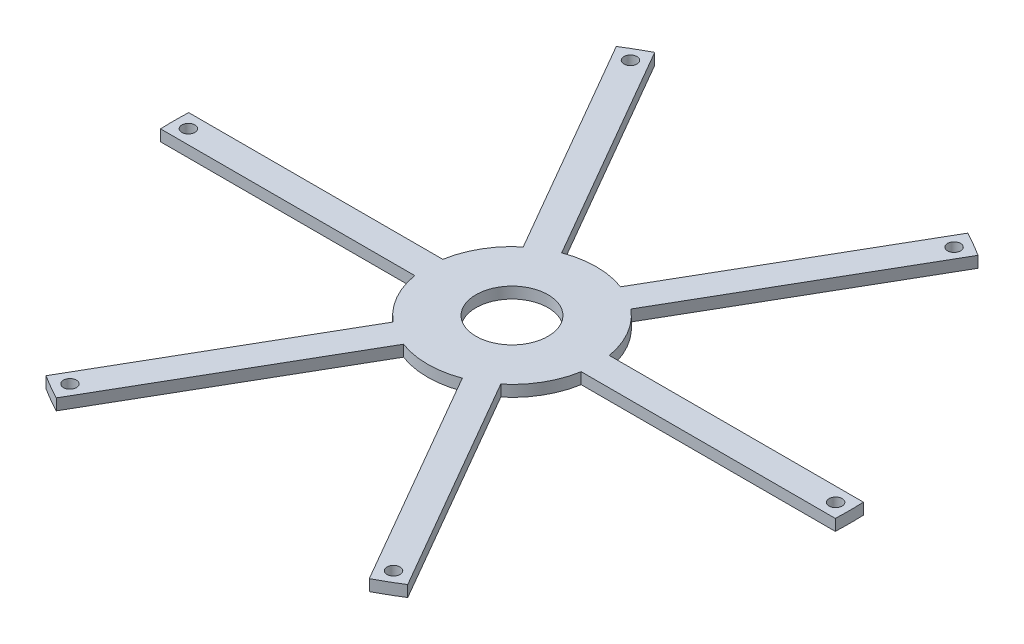
ISO-10303-21;
HEADER;
FILE_DESCRIPTION(('STEP AP214'),'2;1');
FILE_NAME('part.step','',(''),(''),'','','');
FILE_SCHEMA(('AUTOMOTIVE_DESIGN { 1 0 10303 214 1 1 1 1 }'));
ENDSEC;
DATA;
#1=APPLICATION_CONTEXT('core data for automotive mechanical design processes');
#2=APPLICATION_PROTOCOL_DEFINITION('international standard','automotive_design',2000,#1);
#3=PRODUCT_CONTEXT('',#1,'mechanical');
#4=PRODUCT('Part','Part','',(#3));
#5=PRODUCT_RELATED_PRODUCT_CATEGORY('part','',(#4));
#6=PRODUCT_DEFINITION_FORMATION('','',#4);
#7=PRODUCT_DEFINITION_CONTEXT('part definition',#1,'design');
#8=PRODUCT_DEFINITION('design','',#6,#7);
#9=PRODUCT_DEFINITION_SHAPE('','',#8);
#10=(LENGTH_UNIT() NAMED_UNIT(*) SI_UNIT(.MILLI.,.METRE.));
#11=(NAMED_UNIT(*) PLANE_ANGLE_UNIT() SI_UNIT($,.RADIAN.));
#12=(NAMED_UNIT(*) SI_UNIT($,.STERADIAN.) SOLID_ANGLE_UNIT());
#13=UNCERTAINTY_MEASURE_WITH_UNIT(LENGTH_MEASURE(1.E-05),#10,'distance_accuracy_value','');
#14=(GEOMETRIC_REPRESENTATION_CONTEXT(3) GLOBAL_UNCERTAINTY_ASSIGNED_CONTEXT((#13)) GLOBAL_UNIT_ASSIGNED_CONTEXT((#10,
#11,#12)) REPRESENTATION_CONTEXT('',''));
#15=CARTESIAN_POINT('',(0.,0.,0.));
#16=DIRECTION('',(0.,0.,1.));
#17=DIRECTION('',(1.,0.,0.));
#18=AXIS2_PLACEMENT_3D('',#15,#16,#17);
#19=CARTESIAN_POINT('',(0.,2.54,0.));
#20=DIRECTION('',(0.,-1.,0.));
#21=DIRECTION('',(0.,0.,-1.));
#22=AXIS2_PLACEMENT_3D('',#19,#20,#21);
#23=CYLINDRICAL_SURFACE('',#22,19.05);
#24=CARTESIAN_POINT('',(0.,0.,0.));
#25=DIRECTION('',(0.,1.,0.));
#26=DIRECTION('',(0.,0.,1.));
#27=AXIS2_PLACEMENT_3D('',#24,#25,#26);
#28=CIRCLE('',#27,19.05);
#29=CARTESIAN_POINT('',(18.7835533113413,0.,-3.175));
#30=VERTEX_POINT('',#29);
#31=CARTESIAN_POINT('',(12.1414073126864,0.,-14.6795343409607));
#32=VERTEX_POINT('',#31);
#33=EDGE_CURVE('E233',#30,#32,#28,.T.);
#34=ORIENTED_EDGE('',*,*,#33,.T.);
#35=DIRECTION('',(0.,-1.,0.));
#36=VECTOR('',#35,1.);
#37=CARTESIAN_POINT('',(12.1414073126864,2.54,-14.6795343409607));
#38=LINE('',#37,#36);
#39=CARTESIAN_POINT('',(12.1414073126864,2.54,-14.6795343409607));
#40=VERTEX_POINT('',#39);
#41=EDGE_CURVE('E11',#40,#32,#38,.T.);
#42=ORIENTED_EDGE('',*,*,#41,.F.);
#43=CARTESIAN_POINT('',(0.,2.54,0.));
#44=DIRECTION('',(0.,1.,0.));
#45=DIRECTION('',(0.,0.,1.));
#46=AXIS2_PLACEMENT_3D('',#43,#44,#45);
#47=CIRCLE('',#46,19.05);
#48=CARTESIAN_POINT('',(18.7835533113413,2.54,-3.175));
#49=VERTEX_POINT('',#48);
#50=EDGE_CURVE('E282',#49,#40,#47,.T.);
#51=ORIENTED_EDGE('',*,*,#50,.F.);
#52=DIRECTION('',(0.,-1.,0.));
#53=VECTOR('',#52,1.);
#54=CARTESIAN_POINT('',(18.7835533113413,2.54,-3.175));
#55=LINE('',#54,#53);
#56=EDGE_CURVE('E229',#49,#30,#55,.T.);
#57=ORIENTED_EDGE('',*,*,#56,.T.);
#58=EDGE_LOOP('',(#34,#42,#51,#57));
#59=FACE_BOUND('',#58,.T.);
#60=ADVANCED_FACE('F37',(#59),#23,.T.);
#61=CARTESIAN_POINT('',(12.1414073126864,2.54,-14.6795343409607));
#62=DIRECTION('',(-0.866025403784433,0.,-0.50000000000001));
#63=DIRECTION('',(-0.50000000000001,0.,0.866025403784433));
#64=AXIS2_PLACEMENT_3D('',#61,#62,#63);
#65=PLANE('',#64);
#66=DIRECTION('',(0.50000000000001,0.,-0.866025403784433));
#67=VECTOR('',#66,1.);
#68=CARTESIAN_POINT('',(12.1414073126864,0.,-14.6795343409607));
#69=LINE('',#68,#67);
#70=CARTESIAN_POINT('',(40.8165433733111,0.,-64.3463269119117));
#71=VERTEX_POINT('',#70);
#72=EDGE_CURVE('E236',#32,#71,#69,.T.);
#73=ORIENTED_EDGE('',*,*,#72,.T.);
#74=DIRECTION('',(0.,-1.,0.));
#75=VECTOR('',#74,1.);
#76=CARTESIAN_POINT('',(40.8165433733111,2.54,-64.3463269119117));
#77=LINE('',#76,#75);
#78=CARTESIAN_POINT('',(40.8165433733111,2.54,-64.3463269119117));
#79=VERTEX_POINT('',#78);
#80=EDGE_CURVE('E46',#79,#71,#77,.T.);
#81=ORIENTED_EDGE('',*,*,#80,.F.);
#82=DIRECTION('',(0.50000000000001,0.,-0.866025403784433));
#83=VECTOR('',#82,1.);
#84=CARTESIAN_POINT('',(12.1414073126864,2.54,-14.6795343409607));
#85=LINE('',#84,#83);
#86=EDGE_CURVE('E147',#40,#79,#85,.T.);
#87=ORIENTED_EDGE('',*,*,#86,.F.);
#88=ORIENTED_EDGE('',*,*,#41,.T.);
#89=EDGE_LOOP('',(#73,#81,#87,#88));
#90=FACE_BOUND('',#89,.T.);
#91=ADVANCED_FACE('F452',(#90),#65,.F.);
#92=CARTESIAN_POINT('',(0.,2.54,0.));
#93=DIRECTION('',(0.,-1.,0.));
#94=DIRECTION('',(0.,0.,-1.));
#95=AXIS2_PLACEMENT_3D('',#92,#93,#94);
#96=CYLINDRICAL_SURFACE('',#95,76.2);
#97=CARTESIAN_POINT('',(0.,0.,0.));
#98=DIRECTION('',(0.,1.,0.));
#99=DIRECTION('',(0.,0.,1.));
#100=AXIS2_PLACEMENT_3D('',#97,#98,#99);
#101=CIRCLE('',#100,76.2);
#102=CARTESIAN_POINT('',(35.3172820592799,0.,-67.5213269119118));
#103=VERTEX_POINT('',#102);
#104=EDGE_CURVE('E239',#71,#103,#101,.T.);
#105=ORIENTED_EDGE('',*,*,#104,.T.);
#106=DIRECTION('',(0.,-1.,0.));
#107=VECTOR('',#106,1.);
#108=CARTESIAN_POINT('',(35.3172820592799,2.54,-67.5213269119118));
#109=LINE('',#108,#107);
#110=CARTESIAN_POINT('',(35.3172820592799,2.54,-67.5213269119118));
#111=VERTEX_POINT('',#110);
#112=EDGE_CURVE('E338',#111,#103,#109,.T.);
#113=ORIENTED_EDGE('',*,*,#112,.F.);
#114=CARTESIAN_POINT('',(0.,2.54,0.));
#115=DIRECTION('',(0.,1.,0.));
#116=DIRECTION('',(0.,0.,1.));
#117=AXIS2_PLACEMENT_3D('',#114,#115,#116);
#118=CIRCLE('',#117,76.2);
#119=EDGE_CURVE('E386',#79,#111,#118,.T.);
#120=ORIENTED_EDGE('',*,*,#119,.F.);
#121=ORIENTED_EDGE('',*,*,#80,.T.);
#122=EDGE_LOOP('',(#105,#113,#120,#121));
#123=FACE_BOUND('',#122,.T.);
#124=ADVANCED_FACE('F456',(#123),#96,.T.);
#125=CARTESIAN_POINT('',(6.64214599865525,2.54,-17.8545343409608));
#126=DIRECTION('',(0.866025403784433,0.,0.50000000000001));
#127=DIRECTION('',(0.50000000000001,0.,-0.866025403784433));
#128=AXIS2_PLACEMENT_3D('',#125,#126,#127);
#129=PLANE('',#128);
#130=DIRECTION('',(-0.50000000000001,0.,0.866025403784433));
#131=VECTOR('',#130,1.);
#132=CARTESIAN_POINT('',(6.64214599865525,0.,-17.8545343409608));
#133=LINE('',#132,#131);
#134=CARTESIAN_POINT('',(6.64214599865525,0.,-17.8545343409608));
#135=VERTEX_POINT('',#134);
#136=EDGE_CURVE('E241',#103,#135,#133,.T.);
#137=ORIENTED_EDGE('',*,*,#136,.T.);
#138=DIRECTION('',(0.,-1.,0.));
#139=VECTOR('',#138,1.);
#140=CARTESIAN_POINT('',(6.64214599865525,2.54,-17.8545343409608));
#141=LINE('',#140,#139);
#142=CARTESIAN_POINT('',(6.64214599865525,2.54,-17.8545343409608));
#143=VERTEX_POINT('',#142);
#144=EDGE_CURVE('E335',#143,#135,#141,.T.);
#145=ORIENTED_EDGE('',*,*,#144,.F.);
#146=DIRECTION('',(-0.50000000000001,0.,0.866025403784433));
#147=VECTOR('',#146,1.);
#148=CARTESIAN_POINT('',(6.64214599865525,2.54,-17.8545343409608));
#149=LINE('',#148,#147);
#150=EDGE_CURVE('E388',#111,#143,#149,.T.);
#151=ORIENTED_EDGE('',*,*,#150,.F.);
#152=ORIENTED_EDGE('',*,*,#112,.T.);
#153=EDGE_LOOP('',(#137,#145,#151,#152));
#154=FACE_BOUND('',#153,.T.);
#155=ADVANCED_FACE('F460',(#154),#129,.F.);
#156=CARTESIAN_POINT('',(0.,2.54,0.));
#157=DIRECTION('',(0.,-1.,0.));
#158=DIRECTION('',(0.,0.,-1.));
#159=AXIS2_PLACEMENT_3D('',#156,#157,#158);
#160=CYLINDRICAL_SURFACE('',#159,19.05);
#161=CARTESIAN_POINT('',(0.,0.,0.));
#162=DIRECTION('',(0.,1.,0.));
#163=DIRECTION('',(0.,0.,1.));
#164=AXIS2_PLACEMENT_3D('',#161,#162,#163);
#165=CIRCLE('',#164,19.05);
#166=CARTESIAN_POINT('',(-6.64214599865488,0.,-17.8545343409609));
#167=VERTEX_POINT('',#166);
#168=EDGE_CURVE('E243',#135,#167,#165,.T.);
#169=ORIENTED_EDGE('',*,*,#168,.T.);
#170=DIRECTION('',(0.,-1.,0.));
#171=VECTOR('',#170,1.);
#172=CARTESIAN_POINT('',(-6.64214599865488,2.54,-17.8545343409609));
#173=LINE('',#172,#171);
#174=CARTESIAN_POINT('',(-6.64214599865488,2.54,-17.8545343409609));
#175=VERTEX_POINT('',#174);
#176=EDGE_CURVE('E332',#175,#167,#173,.T.);
#177=ORIENTED_EDGE('',*,*,#176,.F.);
#178=CARTESIAN_POINT('',(0.,2.54,0.));
#179=DIRECTION('',(0.,1.,0.));
#180=DIRECTION('',(0.,0.,1.));
#181=AXIS2_PLACEMENT_3D('',#178,#179,#180);
#182=CIRCLE('',#181,19.05);
#183=EDGE_CURVE('E390',#143,#175,#182,.T.);
#184=ORIENTED_EDGE('',*,*,#183,.F.);
#185=ORIENTED_EDGE('',*,*,#144,.T.);
#186=EDGE_LOOP('',(#169,#177,#184,#185));
#187=FACE_BOUND('',#186,.T.);
#188=ADVANCED_FACE('F466',(#187),#160,.T.);
#189=CARTESIAN_POINT('',(-6.64214599865488,2.54,-17.8545343409609));
#190=DIRECTION('',(-0.866025403784427,0.,0.500000000000019));
#191=DIRECTION('',(0.500000000000019,0.,0.866025403784428));
#192=AXIS2_PLACEMENT_3D('',#189,#190,#191);
#193=PLANE('',#192);
#194=DIRECTION('',(-0.500000000000019,0.,-0.866025403784427));
#195=VECTOR('',#194,1.);
#196=CARTESIAN_POINT('',(-6.64214599865488,0.,-17.8545343409609));
#197=LINE('',#196,#195);
#198=CARTESIAN_POINT('',(-35.3172820592796,0.,-67.521326911911));
#199=VERTEX_POINT('',#198);
#200=EDGE_CURVE('E245',#167,#199,#197,.T.);
#201=ORIENTED_EDGE('',*,*,#200,.T.);
#202=DIRECTION('',(0.,-1.,0.));
#203=VECTOR('',#202,1.);
#204=CARTESIAN_POINT('',(-35.3172820592796,2.54,-67.521326911911));
#205=LINE('',#204,#203);
#206=CARTESIAN_POINT('',(-35.3172820592796,2.54,-67.521326911911));
#207=VERTEX_POINT('',#206);
#208=EDGE_CURVE('E329',#207,#199,#205,.T.);
#209=ORIENTED_EDGE('',*,*,#208,.F.);
#210=DIRECTION('',(-0.500000000000019,0.,-0.866025403784427));
#211=VECTOR('',#210,1.);
#212=CARTESIAN_POINT('',(-6.64214599865488,2.54,-17.8545343409609));
#213=LINE('',#212,#211);
#214=EDGE_CURVE('E392',#175,#207,#213,.T.);
#215=ORIENTED_EDGE('',*,*,#214,.F.);
#216=ORIENTED_EDGE('',*,*,#176,.T.);
#217=EDGE_LOOP('',(#201,#209,#215,#216));
#218=FACE_BOUND('',#217,.T.);
#219=ADVANCED_FACE('F470',(#218),#193,.F.);
#220=CARTESIAN_POINT('',(0.,2.54,0.));
#221=DIRECTION('',(0.,-1.,0.));
#222=DIRECTION('',(0.,0.,-1.));
#223=AXIS2_PLACEMENT_3D('',#220,#221,#222);
#224=CYLINDRICAL_SURFACE('',#223,76.1999999999991);
#225=CARTESIAN_POINT('',(0.,0.,0.));
#226=DIRECTION('',(0.,1.,0.));
#227=DIRECTION('',(0.,0.,1.));
#228=AXIS2_PLACEMENT_3D('',#225,#226,#227);
#229=CIRCLE('',#228,76.1999999999991);
#230=CARTESIAN_POINT('',(-40.8165433733108,0.,-64.3463269119109));
#231=VERTEX_POINT('',#230);
#232=EDGE_CURVE('E247',#199,#231,#229,.T.);
#233=ORIENTED_EDGE('',*,*,#232,.T.);
#234=DIRECTION('',(0.,-1.,0.));
#235=VECTOR('',#234,1.);
#236=CARTESIAN_POINT('',(-40.8165433733108,2.54,-64.3463269119109));
#237=LINE('',#236,#235);
#238=CARTESIAN_POINT('',(-40.8165433733108,2.54,-64.3463269119109));
#239=VERTEX_POINT('',#238);
#240=EDGE_CURVE('E326',#239,#231,#237,.T.);
#241=ORIENTED_EDGE('',*,*,#240,.F.);
#242=CARTESIAN_POINT('',(0.,2.54,0.));
#243=DIRECTION('',(0.,1.,0.));
#244=DIRECTION('',(0.,0.,1.));
#245=AXIS2_PLACEMENT_3D('',#242,#243,#244);
#246=CIRCLE('',#245,76.1999999999991);
#247=EDGE_CURVE('E394',#207,#239,#246,.T.);
#248=ORIENTED_EDGE('',*,*,#247,.F.);
#249=ORIENTED_EDGE('',*,*,#208,.T.);
#250=EDGE_LOOP('',(#233,#241,#248,#249));
#251=FACE_BOUND('',#250,.T.);
#252=ADVANCED_FACE('F474',(#251),#224,.T.);
#253=CARTESIAN_POINT('',(-12.1414073126861,2.54,-14.679534340961));
#254=DIRECTION('',(0.866025403784427,0.,-0.500000000000019));
#255=DIRECTION('',(-0.500000000000019,0.,-0.866025403784428));
#256=AXIS2_PLACEMENT_3D('',#253,#254,#255);
#257=PLANE('',#256);
#258=DIRECTION('',(0.500000000000019,0.,0.866025403784428));
#259=VECTOR('',#258,1.);
#260=CARTESIAN_POINT('',(-12.1414073126861,0.,-14.679534340961));
#261=LINE('',#260,#259);
#262=CARTESIAN_POINT('',(-12.1414073126859,0.,-14.6795343409608));
#263=VERTEX_POINT('',#262);
#264=EDGE_CURVE('E249',#231,#263,#261,.T.);
#265=ORIENTED_EDGE('',*,*,#264,.T.);
#266=DIRECTION('',(0.,-1.,0.));
#267=VECTOR('',#266,1.);
#268=CARTESIAN_POINT('',(-12.1414073126859,2.54,-14.6795343409608));
#269=LINE('',#268,#267);
#270=CARTESIAN_POINT('',(-12.1414073126859,2.54,-14.6795343409608));
#271=VERTEX_POINT('',#270);
#272=EDGE_CURVE('E323',#271,#263,#269,.T.);
#273=ORIENTED_EDGE('',*,*,#272,.F.);
#274=DIRECTION('',(0.500000000000019,0.,0.866025403784428));
#275=VECTOR('',#274,1.);
#276=CARTESIAN_POINT('',(-12.1414073126861,2.54,-14.679534340961));
#277=LINE('',#276,#275);
#278=EDGE_CURVE('E396',#239,#271,#277,.T.);
#279=ORIENTED_EDGE('',*,*,#278,.F.);
#280=ORIENTED_EDGE('',*,*,#240,.T.);
#281=EDGE_LOOP('',(#265,#273,#279,#280));
#282=FACE_BOUND('',#281,.T.);
#283=ADVANCED_FACE('F478',(#282),#257,.F.);
#284=CARTESIAN_POINT('',(0.,2.54,0.));
#285=DIRECTION('',(0.,-1.,0.));
#286=DIRECTION('',(0.,0.,-1.));
#287=AXIS2_PLACEMENT_3D('',#284,#285,#286);
#288=CYLINDRICAL_SURFACE('',#287,19.0499999999997);
#289=CARTESIAN_POINT('',(0.,0.,0.));
#290=DIRECTION('',(0.,1.,0.));
#291=DIRECTION('',(0.,0.,1.));
#292=AXIS2_PLACEMENT_3D('',#289,#290,#291);
#293=CIRCLE('',#292,19.0499999999997);
#294=CARTESIAN_POINT('',(-18.783553311341,0.,-3.17499999999843));
#295=VERTEX_POINT('',#294);
#296=EDGE_CURVE('E251',#263,#295,#293,.T.);
#297=ORIENTED_EDGE('',*,*,#296,.T.);
#298=DIRECTION('',(0.,-1.,0.));
#299=VECTOR('',#298,1.);
#300=CARTESIAN_POINT('',(-18.783553311341,2.54,-3.17499999999843));
#301=LINE('',#300,#299);
#302=CARTESIAN_POINT('',(-18.783553311341,2.54,-3.17499999999843));
#303=VERTEX_POINT('',#302);
#304=EDGE_CURVE('E320',#303,#295,#301,.T.);
#305=ORIENTED_EDGE('',*,*,#304,.F.);
#306=CARTESIAN_POINT('',(0.,2.54,0.));
#307=DIRECTION('',(0.,1.,0.));
#308=DIRECTION('',(0.,0.,1.));
#309=AXIS2_PLACEMENT_3D('',#306,#307,#308);
#310=CIRCLE('',#309,19.0499999999997);
#311=EDGE_CURVE('E398',#271,#303,#310,.T.);
#312=ORIENTED_EDGE('',*,*,#311,.F.);
#313=ORIENTED_EDGE('',*,*,#272,.T.);
#314=EDGE_LOOP('',(#297,#305,#312,#313));
#315=FACE_BOUND('',#314,.T.);
#316=ADVANCED_FACE('F482',(#315),#288,.T.);
#317=CARTESIAN_POINT('',(-18.783553311341,2.54,-3.17499999999843));
#318=DIRECTION('',(0.,0.,1.));
#319=DIRECTION('',(1.,0.,0.));
#320=AXIS2_PLACEMENT_3D('',#317,#318,#319);
#321=PLANE('',#320);
#322=DIRECTION('',(-1.,0.,0.));
#323=VECTOR('',#322,1.);
#324=CARTESIAN_POINT('',(-18.783553311341,0.,-3.17499999999843));
#325=LINE('',#324,#323);
#326=CARTESIAN_POINT('',(-76.1338254325892,0.,-3.17499999999844));
#327=VERTEX_POINT('',#326);
#328=EDGE_CURVE('E253',#295,#327,#325,.T.);
#329=ORIENTED_EDGE('',*,*,#328,.T.);
#330=DIRECTION('',(0.,-1.,0.));
#331=VECTOR('',#330,1.);
#332=CARTESIAN_POINT('',(-76.1338254325892,2.54,-3.17499999999844));
#333=LINE('',#332,#331);
#334=CARTESIAN_POINT('',(-76.1338254325892,2.54,-3.17499999999844));
#335=VERTEX_POINT('',#334);
#336=EDGE_CURVE('E317',#335,#327,#333,.T.);
#337=ORIENTED_EDGE('',*,*,#336,.F.);
#338=DIRECTION('',(-1.,0.,0.));
#339=VECTOR('',#338,1.);
#340=CARTESIAN_POINT('',(-18.783553311341,2.54,-3.17499999999843));
#341=LINE('',#340,#339);
#342=EDGE_CURVE('E400',#303,#335,#341,.T.);
#343=ORIENTED_EDGE('',*,*,#342,.F.);
#344=ORIENTED_EDGE('',*,*,#304,.T.);
#345=EDGE_LOOP('',(#329,#337,#343,#344));
#346=FACE_BOUND('',#345,.T.);
#347=ADVANCED_FACE('F486',(#346),#321,.F.);
#348=CARTESIAN_POINT('',(0.,2.54,0.));
#349=DIRECTION('',(0.,-1.,0.));
#350=DIRECTION('',(0.,0.,-1.));
#351=AXIS2_PLACEMENT_3D('',#348,#349,#350);
#352=CYLINDRICAL_SURFACE('',#351,76.1999999999997);
#353=CARTESIAN_POINT('',(0.,0.,0.));
#354=DIRECTION('',(0.,1.,0.));
#355=DIRECTION('',(0.,0.,1.));
#356=AXIS2_PLACEMENT_3D('',#353,#354,#355);
#357=CIRCLE('',#356,76.1999999999997);
#358=CARTESIAN_POINT('',(-76.1338254325892,0.,3.17500000000157));
#359=VERTEX_POINT('',#358);
#360=EDGE_CURVE('E255',#327,#359,#357,.T.);
#361=ORIENTED_EDGE('',*,*,#360,.T.);
#362=DIRECTION('',(0.,-1.,0.));
#363=VECTOR('',#362,1.);
#364=CARTESIAN_POINT('',(-76.1338254325892,2.54,3.17500000000157));
#365=LINE('',#364,#363);
#366=CARTESIAN_POINT('',(-76.1338254325892,2.54,3.17500000000157));
#367=VERTEX_POINT('',#366);
#368=EDGE_CURVE('E314',#367,#359,#365,.T.);
#369=ORIENTED_EDGE('',*,*,#368,.F.);
#370=CARTESIAN_POINT('',(0.,2.54,0.));
#371=DIRECTION('',(0.,1.,0.));
#372=DIRECTION('',(0.,0.,1.));
#373=AXIS2_PLACEMENT_3D('',#370,#371,#372);
#374=CIRCLE('',#373,76.1999999999997);
#375=EDGE_CURVE('E402',#335,#367,#374,.T.);
#376=ORIENTED_EDGE('',*,*,#375,.F.);
#377=ORIENTED_EDGE('',*,*,#336,.T.);
#378=EDGE_LOOP('',(#361,#369,#376,#377));
#379=FACE_BOUND('',#378,.T.);
#380=ADVANCED_FACE('F490',(#379),#352,.T.);
#381=CARTESIAN_POINT('',(-18.783553311341,2.54,3.17500000000157));
#382=DIRECTION('',(0.,0.,-1.));
#383=DIRECTION('',(-1.,0.,0.));
#384=AXIS2_PLACEMENT_3D('',#381,#382,#383);
#385=PLANE('',#384);
#386=DIRECTION('',(1.,0.,0.));
#387=VECTOR('',#386,1.);
#388=CARTESIAN_POINT('',(-18.783553311341,0.,3.17500000000157));
#389=LINE('',#388,#387);
#390=CARTESIAN_POINT('',(-18.783553311341,0.,3.17500000000156));
#391=VERTEX_POINT('',#390);
#392=EDGE_CURVE('E257',#359,#391,#389,.T.);
#393=ORIENTED_EDGE('',*,*,#392,.T.);
#394=DIRECTION('',(0.,-1.,0.));
#395=VECTOR('',#394,1.);
#396=CARTESIAN_POINT('',(-18.783553311341,2.54,3.17500000000156));
#397=LINE('',#396,#395);
#398=CARTESIAN_POINT('',(-18.783553311341,2.54,3.17500000000156));
#399=VERTEX_POINT('',#398);
#400=EDGE_CURVE('E311',#399,#391,#397,.T.);
#401=ORIENTED_EDGE('',*,*,#400,.F.);
#402=DIRECTION('',(1.,0.,0.));
#403=VECTOR('',#402,1.);
#404=CARTESIAN_POINT('',(-18.783553311341,2.54,3.17500000000157));
#405=LINE('',#404,#403);
#406=EDGE_CURVE('E404',#367,#399,#405,.T.);
#407=ORIENTED_EDGE('',*,*,#406,.F.);
#408=ORIENTED_EDGE('',*,*,#368,.T.);
#409=EDGE_LOOP('',(#393,#401,#407,#408));
#410=FACE_BOUND('',#409,.T.);
#411=ADVANCED_FACE('F494',(#410),#385,.F.);
#412=CARTESIAN_POINT('',(0.,2.54,0.));
#413=DIRECTION('',(0.,-1.,0.));
#414=DIRECTION('',(0.,0.,-1.));
#415=AXIS2_PLACEMENT_3D('',#412,#413,#414);
#416=CYLINDRICAL_SURFACE('',#415,19.05);
#417=CARTESIAN_POINT('',(0.,0.,0.));
#418=DIRECTION('',(0.,1.,0.));
#419=DIRECTION('',(0.,0.,1.));
#420=AXIS2_PLACEMENT_3D('',#417,#418,#419);
#421=CIRCLE('',#420,19.05);
#422=CARTESIAN_POINT('',(-12.1414073126863,0.,14.6795343409608));
#423=VERTEX_POINT('',#422);
#424=EDGE_CURVE('E259',#391,#423,#421,.T.);
#425=ORIENTED_EDGE('',*,*,#424,.T.);
#426=DIRECTION('',(0.,-1.,0.));
#427=VECTOR('',#426,1.);
#428=CARTESIAN_POINT('',(-12.1414073126863,2.54,14.6795343409608));
#429=LINE('',#428,#427);
#430=CARTESIAN_POINT('',(-12.1414073126863,2.54,14.6795343409608));
#431=VERTEX_POINT('',#430);
#432=EDGE_CURVE('E307',#431,#423,#429,.T.);
#433=ORIENTED_EDGE('',*,*,#432,.F.);
#434=CARTESIAN_POINT('',(0.,2.54,0.));
#435=DIRECTION('',(0.,1.,0.));
#436=DIRECTION('',(0.,0.,1.));
#437=AXIS2_PLACEMENT_3D('',#434,#435,#436);
#438=CIRCLE('',#437,19.05);
#439=EDGE_CURVE('E406',#399,#431,#438,.T.);
#440=ORIENTED_EDGE('',*,*,#439,.F.);
#441=ORIENTED_EDGE('',*,*,#400,.T.);
#442=EDGE_LOOP('',(#425,#433,#440,#441));
#443=FACE_BOUND('',#442,.T.);
#444=ADVANCED_FACE('F498',(#443),#416,.T.);
#445=CARTESIAN_POINT('',(-12.1414073126863,2.54,14.6795343409608));
#446=DIRECTION('',(0.866025403784451,0.,0.499999999999979));
#447=DIRECTION('',(0.499999999999979,0.,-0.866025403784451));
#448=AXIS2_PLACEMENT_3D('',#445,#446,#447);
#449=PLANE('',#448);
#450=DIRECTION('',(-0.499999999999979,0.,0.866025403784451));
#451=VECTOR('',#450,1.);
#452=CARTESIAN_POINT('',(-12.1414073126863,0.,14.6795343409608));
#453=LINE('',#452,#451);
#454=CARTESIAN_POINT('',(-40.8165433733095,0.,64.3463269119133));
#455=VERTEX_POINT('',#454);
#456=EDGE_CURVE('E262',#423,#455,#453,.T.);
#457=ORIENTED_EDGE('',*,*,#456,.T.);
#458=DIRECTION('',(0.,-1.,0.));
#459=VECTOR('',#458,1.);
#460=CARTESIAN_POINT('',(-40.8165433733095,2.54,64.3463269119133));
#461=LINE('',#460,#459);
#462=CARTESIAN_POINT('',(-40.8165433733095,2.54,64.3463269119133));
#463=VERTEX_POINT('',#462);
#464=EDGE_CURVE('E304',#463,#455,#461,.T.);
#465=ORIENTED_EDGE('',*,*,#464,.F.);
#466=DIRECTION('',(-0.499999999999979,0.,0.866025403784451));
#467=VECTOR('',#466,1.);
#468=CARTESIAN_POINT('',(-12.1414073126863,2.54,14.6795343409608));
#469=LINE('',#468,#467);
#470=EDGE_CURVE('E409',#431,#463,#469,.T.);
#471=ORIENTED_EDGE('',*,*,#470,.F.);
#472=ORIENTED_EDGE('',*,*,#432,.T.);
#473=EDGE_LOOP('',(#457,#465,#471,#472));
#474=FACE_BOUND('',#473,.T.);
#475=ADVANCED_FACE('F502',(#474),#449,.F.);
#476=CARTESIAN_POINT('',(0.,2.54,0.));
#477=DIRECTION('',(0.,-1.,0.));
#478=DIRECTION('',(0.,0.,-1.));
#479=AXIS2_PLACEMENT_3D('',#476,#477,#478);
#480=CYLINDRICAL_SURFACE('',#479,76.2000000000005);
#481=CARTESIAN_POINT('',(0.,0.,0.));
#482=DIRECTION('',(0.,1.,0.));
#483=DIRECTION('',(0.,0.,1.));
#484=AXIS2_PLACEMENT_3D('',#481,#482,#483);
#485=CIRCLE('',#484,76.2000000000005);
#486=CARTESIAN_POINT('',(-35.3172820592782,0.,67.5213269119133));
#487=VERTEX_POINT('',#486);
#488=EDGE_CURVE('E265',#455,#487,#485,.T.);
#489=ORIENTED_EDGE('',*,*,#488,.T.);
#490=DIRECTION('',(0.,-1.,0.));
#491=VECTOR('',#490,1.);
#492=CARTESIAN_POINT('',(-35.3172820592782,2.54,67.5213269119133));
#493=LINE('',#492,#491);
#494=CARTESIAN_POINT('',(-35.3172820592782,2.54,67.5213269119133));
#495=VERTEX_POINT('',#494);
#496=EDGE_CURVE('E301',#495,#487,#493,.T.);
#497=ORIENTED_EDGE('',*,*,#496,.F.);
#498=CARTESIAN_POINT('',(0.,2.54,0.));
#499=DIRECTION('',(0.,1.,0.));
#500=DIRECTION('',(0.,0.,1.));
#501=AXIS2_PLACEMENT_3D('',#498,#499,#500);
#502=CIRCLE('',#501,76.2000000000005);
#503=EDGE_CURVE('E412',#463,#495,#502,.T.);
#504=ORIENTED_EDGE('',*,*,#503,.F.);
#505=ORIENTED_EDGE('',*,*,#464,.T.);
#506=EDGE_LOOP('',(#489,#497,#504,#505));
#507=FACE_BOUND('',#506,.T.);
#508=ADVANCED_FACE('F506',(#507),#480,.T.);
#509=CARTESIAN_POINT('',(-6.64214599865513,2.54,17.8545343409608));
#510=DIRECTION('',(-0.866025403784451,0.,-0.499999999999979));
#511=DIRECTION('',(-0.499999999999979,0.,0.866025403784451));
#512=AXIS2_PLACEMENT_3D('',#509,#510,#511);
#513=PLANE('',#512);
#514=DIRECTION('',(0.499999999999979,0.,-0.866025403784451));
#515=VECTOR('',#514,1.);
#516=CARTESIAN_POINT('',(-6.64214599865513,0.,17.8545343409608));
#517=LINE('',#516,#515);
#518=CARTESIAN_POINT('',(-6.64214599865514,0.,17.8545343409608));
#519=VERTEX_POINT('',#518);
#520=EDGE_CURVE('E267',#487,#519,#517,.T.);
#521=ORIENTED_EDGE('',*,*,#520,.T.);
#522=DIRECTION('',(0.,-1.,0.));
#523=VECTOR('',#522,1.);
#524=CARTESIAN_POINT('',(-6.64214599865514,2.54,17.8545343409608));
#525=LINE('',#524,#523);
#526=CARTESIAN_POINT('',(-6.64214599865514,2.54,17.8545343409608));
#527=VERTEX_POINT('',#526);
#528=EDGE_CURVE('E298',#527,#519,#525,.T.);
#529=ORIENTED_EDGE('',*,*,#528,.F.);
#530=DIRECTION('',(0.499999999999979,0.,-0.866025403784451));
#531=VECTOR('',#530,1.);
#532=CARTESIAN_POINT('',(-6.64214599865513,2.54,17.8545343409608));
#533=LINE('',#532,#531);
#534=EDGE_CURVE('E414',#495,#527,#533,.T.);
#535=ORIENTED_EDGE('',*,*,#534,.F.);
#536=ORIENTED_EDGE('',*,*,#496,.T.);
#537=EDGE_LOOP('',(#521,#529,#535,#536));
#538=FACE_BOUND('',#537,.T.);
#539=ADVANCED_FACE('F510',(#538),#513,.F.);
#540=CARTESIAN_POINT('',(0.,2.54,0.));
#541=DIRECTION('',(0.,-1.,0.));
#542=DIRECTION('',(0.,0.,-1.));
#543=AXIS2_PLACEMENT_3D('',#540,#541,#542);
#544=CYLINDRICAL_SURFACE('',#543,19.05);
#545=CARTESIAN_POINT('',(0.,0.,0.));
#546=DIRECTION('',(0.,1.,0.));
#547=DIRECTION('',(0.,0.,1.));
#548=AXIS2_PLACEMENT_3D('',#545,#546,#547);
#549=CIRCLE('',#548,19.05);
#550=CARTESIAN_POINT('',(6.64214599865501,0.,17.8545343409609));
#551=VERTEX_POINT('',#550);
#552=EDGE_CURVE('E269',#519,#551,#549,.T.);
#553=ORIENTED_EDGE('',*,*,#552,.T.);
#554=DIRECTION('',(0.,-1.,0.));
#555=VECTOR('',#554,1.);
#556=CARTESIAN_POINT('',(6.64214599865501,2.54,17.8545343409609));
#557=LINE('',#556,#555);
#558=CARTESIAN_POINT('',(6.64214599865501,2.54,17.8545343409609));
#559=VERTEX_POINT('',#558);
#560=EDGE_CURVE('E295',#559,#551,#557,.T.);
#561=ORIENTED_EDGE('',*,*,#560,.F.);
#562=CARTESIAN_POINT('',(0.,2.54,0.));
#563=DIRECTION('',(0.,1.,0.));
#564=DIRECTION('',(0.,0.,1.));
#565=AXIS2_PLACEMENT_3D('',#562,#563,#564);
#566=CIRCLE('',#565,19.05);
#567=EDGE_CURVE('E416',#527,#559,#566,.T.);
#568=ORIENTED_EDGE('',*,*,#567,.F.);
#569=ORIENTED_EDGE('',*,*,#528,.T.);
#570=EDGE_LOOP('',(#553,#561,#568,#569));
#571=FACE_BOUND('',#570,.T.);
#572=ADVANCED_FACE('F514',(#571),#544,.T.);
#573=CARTESIAN_POINT('',(6.64214599865501,2.54,17.8545343409609));
#574=DIRECTION('',(0.86602540378444,0.,-0.499999999999998));
#575=DIRECTION('',(-0.499999999999998,0.,-0.86602540378444));
#576=AXIS2_PLACEMENT_3D('',#573,#574,#575);
#577=PLANE('',#576);
#578=DIRECTION('',(0.499999999999998,0.,0.86602540378444));
#579=VECTOR('',#578,1.);
#580=CARTESIAN_POINT('',(6.64214599865501,0.,17.8545343409609));
#581=LINE('',#580,#579);
#582=CARTESIAN_POINT('',(35.317282059279,0.,67.5213269119123));
#583=VERTEX_POINT('',#582);
#584=EDGE_CURVE('E271',#551,#583,#581,.T.);
#585=ORIENTED_EDGE('',*,*,#584,.T.);
#586=DIRECTION('',(0.,-1.,0.));
#587=VECTOR('',#586,1.);
#588=CARTESIAN_POINT('',(35.317282059279,2.54,67.5213269119123));
#589=LINE('',#588,#587);
#590=CARTESIAN_POINT('',(35.317282059279,2.54,67.5213269119123));
#591=VERTEX_POINT('',#590);
#592=EDGE_CURVE('E292',#591,#583,#589,.T.);
#593=ORIENTED_EDGE('',*,*,#592,.F.);
#594=DIRECTION('',(0.499999999999998,0.,0.86602540378444));
#595=VECTOR('',#594,1.);
#596=CARTESIAN_POINT('',(6.64214599865501,2.54,17.8545343409609));
#597=LINE('',#596,#595);
#598=EDGE_CURVE('E418',#559,#591,#597,.T.);
#599=ORIENTED_EDGE('',*,*,#598,.F.);
#600=ORIENTED_EDGE('',*,*,#560,.T.);
#601=EDGE_LOOP('',(#585,#593,#599,#600));
#602=FACE_BOUND('',#601,.T.);
#603=ADVANCED_FACE('F518',(#602),#577,.F.);
#604=CARTESIAN_POINT('',(0.,2.54,0.));
#605=DIRECTION('',(0.,-1.,0.));
#606=DIRECTION('',(0.,0.,-1.));
#607=AXIS2_PLACEMENT_3D('',#604,#605,#606);
#608=CYLINDRICAL_SURFACE('',#607,76.2);
#609=CARTESIAN_POINT('',(0.,0.,0.));
#610=DIRECTION('',(0.,1.,0.));
#611=DIRECTION('',(0.,0.,1.));
#612=AXIS2_PLACEMENT_3D('',#609,#610,#611);
#613=CIRCLE('',#612,76.2);
#614=CARTESIAN_POINT('',(40.8165433733102,0.,64.3463269119123));
#615=VERTEX_POINT('',#614);
#616=EDGE_CURVE('E273',#583,#615,#613,.T.);
#617=ORIENTED_EDGE('',*,*,#616,.T.);
#618=DIRECTION('',(0.,-1.,0.));
#619=VECTOR('',#618,1.);
#620=CARTESIAN_POINT('',(40.8165433733102,2.54,64.3463269119123));
#621=LINE('',#620,#619);
#622=CARTESIAN_POINT('',(40.8165433733102,2.54,64.3463269119123));
#623=VERTEX_POINT('',#622);
#624=EDGE_CURVE('E289',#623,#615,#621,.T.);
#625=ORIENTED_EDGE('',*,*,#624,.F.);
#626=CARTESIAN_POINT('',(0.,2.54,0.));
#627=DIRECTION('',(0.,1.,0.));
#628=DIRECTION('',(0.,0.,1.));
#629=AXIS2_PLACEMENT_3D('',#626,#627,#628);
#630=CIRCLE('',#629,76.2);
#631=EDGE_CURVE('E420',#591,#623,#630,.T.);
#632=ORIENTED_EDGE('',*,*,#631,.F.);
#633=ORIENTED_EDGE('',*,*,#592,.T.);
#634=EDGE_LOOP('',(#617,#625,#632,#633));
#635=FACE_BOUND('',#634,.T.);
#636=ADVANCED_FACE('F522',(#635),#608,.T.);
#637=CARTESIAN_POINT('',(12.1414073126862,2.54,14.6795343409609));
#638=DIRECTION('',(-0.86602540378444,0.,0.499999999999998));
#639=DIRECTION('',(0.499999999999998,0.,0.86602540378444));
#640=AXIS2_PLACEMENT_3D('',#637,#638,#639);
#641=PLANE('',#640);
#642=DIRECTION('',(-0.499999999999998,0.,-0.86602540378444));
#643=VECTOR('',#642,1.);
#644=CARTESIAN_POINT('',(12.1414073126862,0.,14.6795343409609));
#645=LINE('',#644,#643);
#646=CARTESIAN_POINT('',(12.1414073126862,0.,14.6795343409609));
#647=VERTEX_POINT('',#646);
#648=EDGE_CURVE('E275',#615,#647,#645,.T.);
#649=ORIENTED_EDGE('',*,*,#648,.T.);
#650=DIRECTION('',(0.,-1.,0.));
#651=VECTOR('',#650,1.);
#652=CARTESIAN_POINT('',(12.1414073126862,2.54,14.6795343409609));
#653=LINE('',#652,#651);
#654=CARTESIAN_POINT('',(12.1414073126862,2.54,14.6795343409609));
#655=VERTEX_POINT('',#654);
#656=EDGE_CURVE('E286',#655,#647,#653,.T.);
#657=ORIENTED_EDGE('',*,*,#656,.F.);
#658=DIRECTION('',(-0.499999999999998,0.,-0.86602540378444));
#659=VECTOR('',#658,1.);
#660=CARTESIAN_POINT('',(12.1414073126862,2.54,14.6795343409609));
#661=LINE('',#660,#659);
#662=EDGE_CURVE('E422',#623,#655,#661,.T.);
#663=ORIENTED_EDGE('',*,*,#662,.F.);
#664=ORIENTED_EDGE('',*,*,#624,.T.);
#665=EDGE_LOOP('',(#649,#657,#663,#664));
#666=FACE_BOUND('',#665,.T.);
#667=ADVANCED_FACE('F428',(#666),#641,.F.);
#668=CARTESIAN_POINT('',(0.,2.54,0.));
#669=DIRECTION('',(0.,-1.,0.));
#670=DIRECTION('',(0.,0.,-1.));
#671=AXIS2_PLACEMENT_3D('',#668,#669,#670);
#672=CYLINDRICAL_SURFACE('',#671,19.05);
#673=CARTESIAN_POINT('',(0.,0.,0.));
#674=DIRECTION('',(0.,1.,0.));
#675=DIRECTION('',(0.,0.,1.));
#676=AXIS2_PLACEMENT_3D('',#673,#674,#675);
#677=CIRCLE('',#676,19.05);
#678=CARTESIAN_POINT('',(18.7835533113413,0.,3.175));
#679=VERTEX_POINT('',#678);
#680=EDGE_CURVE('E277',#647,#679,#677,.T.);
#681=ORIENTED_EDGE('',*,*,#680,.T.);
#682=DIRECTION('',(0.,-1.,0.));
#683=VECTOR('',#682,1.);
#684=CARTESIAN_POINT('',(18.7835533113413,2.54,3.175));
#685=LINE('',#684,#683);
#686=CARTESIAN_POINT('',(18.7835533113413,2.54,3.175));
#687=VERTEX_POINT('',#686);
#688=EDGE_CURVE('E224',#687,#679,#685,.T.);
#689=ORIENTED_EDGE('',*,*,#688,.F.);
#690=CARTESIAN_POINT('',(0.,2.54,0.));
#691=DIRECTION('',(0.,1.,0.));
#692=DIRECTION('',(0.,0.,1.));
#693=AXIS2_PLACEMENT_3D('',#690,#691,#692);
#694=CIRCLE('',#693,19.05);
#695=EDGE_CURVE('E215',#655,#687,#694,.T.);
#696=ORIENTED_EDGE('',*,*,#695,.F.);
#697=ORIENTED_EDGE('',*,*,#656,.T.);
#698=EDGE_LOOP('',(#681,#689,#696,#697));
#699=FACE_BOUND('',#698,.T.);
#700=ADVANCED_FACE('F432',(#699),#672,.T.);
#701=CARTESIAN_POINT('',(18.7835533113413,2.54,3.175));
#702=DIRECTION('',(0.,0.,-1.));
#703=DIRECTION('',(-1.,0.,0.));
#704=AXIS2_PLACEMENT_3D('',#701,#702,#703);
#705=PLANE('',#704);
#706=DIRECTION('',(1.,0.,0.));
#707=VECTOR('',#706,1.);
#708=CARTESIAN_POINT('',(18.7835533113413,0.,3.175));
#709=LINE('',#708,#707);
#710=CARTESIAN_POINT('',(76.1338254325894,0.,3.175));
#711=VERTEX_POINT('',#710);
#712=EDGE_CURVE('E223',#679,#711,#709,.T.);
#713=ORIENTED_EDGE('',*,*,#712,.T.);
#714=DIRECTION('',(0.,-1.,0.));
#715=VECTOR('',#714,1.);
#716=CARTESIAN_POINT('',(76.1338254325894,2.54,3.175));
#717=LINE('',#716,#715);
#718=CARTESIAN_POINT('',(76.1338254325894,2.54,3.175));
#719=VERTEX_POINT('',#718);
#720=EDGE_CURVE('E220',#719,#711,#717,.T.);
#721=ORIENTED_EDGE('',*,*,#720,.F.);
#722=DIRECTION('',(1.,0.,0.));
#723=VECTOR('',#722,1.);
#724=CARTESIAN_POINT('',(18.7835533113413,2.54,3.175));
#725=LINE('',#724,#723);
#726=EDGE_CURVE('E209',#687,#719,#725,.T.);
#727=ORIENTED_EDGE('',*,*,#726,.F.);
#728=ORIENTED_EDGE('',*,*,#688,.T.);
#729=EDGE_LOOP('',(#713,#721,#727,#728));
#730=FACE_BOUND('',#729,.T.);
#731=ADVANCED_FACE('F221',(#730),#705,.F.);
#732=CARTESIAN_POINT('',(0.,2.54,0.));
#733=DIRECTION('',(0.,-1.,0.));
#734=DIRECTION('',(0.,0.,-1.));
#735=AXIS2_PLACEMENT_3D('',#732,#733,#734);
#736=CYLINDRICAL_SURFACE('',#735,76.2);
#737=CARTESIAN_POINT('',(0.,0.,0.));
#738=DIRECTION('',(0.,1.,0.));
#739=DIRECTION('',(0.,0.,1.));
#740=AXIS2_PLACEMENT_3D('',#737,#738,#739);
#741=CIRCLE('',#740,76.2);
#742=CARTESIAN_POINT('',(76.1338254325894,0.,-3.175));
#743=VERTEX_POINT('',#742);
#744=EDGE_CURVE('E133',#711,#743,#741,.T.);
#745=ORIENTED_EDGE('',*,*,#744,.T.);
#746=DIRECTION('',(0.,-1.,0.));
#747=VECTOR('',#746,1.);
#748=CARTESIAN_POINT('',(76.1338254325894,2.54,-3.175));
#749=LINE('',#748,#747);
#750=CARTESIAN_POINT('',(76.1338254325894,2.54,-3.175));
#751=VERTEX_POINT('',#750);
#752=EDGE_CURVE('E225',#751,#743,#749,.T.);
#753=ORIENTED_EDGE('',*,*,#752,.F.);
#754=CARTESIAN_POINT('',(0.,2.54,0.));
#755=DIRECTION('',(0.,1.,0.));
#756=DIRECTION('',(0.,0.,1.));
#757=AXIS2_PLACEMENT_3D('',#754,#755,#756);
#758=CIRCLE('',#757,76.2);
#759=EDGE_CURVE('E213',#719,#751,#758,.T.);
#760=ORIENTED_EDGE('',*,*,#759,.F.);
#761=ORIENTED_EDGE('',*,*,#720,.T.);
#762=EDGE_LOOP('',(#745,#753,#760,#761));
#763=FACE_BOUND('',#762,.T.);
#764=ADVANCED_FACE('F227',(#763),#736,.T.);
#765=CARTESIAN_POINT('',(18.7835533113413,2.54,-3.175));
#766=DIRECTION('',(0.,0.,1.));
#767=DIRECTION('',(1.,0.,0.));
#768=AXIS2_PLACEMENT_3D('',#765,#766,#767);
#769=PLANE('',#768);
#770=DIRECTION('',(-1.,0.,0.));
#771=VECTOR('',#770,1.);
#772=CARTESIAN_POINT('',(18.7835533113413,0.,-3.175));
#773=LINE('',#772,#771);
#774=EDGE_CURVE('E139',#743,#30,#773,.T.);
#775=ORIENTED_EDGE('',*,*,#774,.T.);
#776=ORIENTED_EDGE('',*,*,#56,.F.);
#777=DIRECTION('',(-1.,0.,0.));
#778=VECTOR('',#777,1.);
#779=CARTESIAN_POINT('',(18.7835533113413,2.54,-3.175));
#780=LINE('',#779,#778);
#781=EDGE_CURVE('E55',#751,#49,#780,.T.);
#782=ORIENTED_EDGE('',*,*,#781,.F.);
#783=ORIENTED_EDGE('',*,*,#752,.T.);
#784=EDGE_LOOP('',(#775,#776,#782,#783));
#785=FACE_BOUND('',#784,.T.);
#786=ADVANCED_FACE('F440',(#785),#769,.F.);
#787=CARTESIAN_POINT('',(0.,2.54,0.));
#788=DIRECTION('',(0.,1.,0.));
#789=DIRECTION('',(0.,0.,1.));
#790=AXIS2_PLACEMENT_3D('',#787,#788,#789);
#791=PLANE('',#790);
#792=CARTESIAN_POINT('',(-73.025,2.54,0.));
#793=DIRECTION('',(0.,1.,0.));
#794=DIRECTION('',(0.,0.,1.));
#795=AXIS2_PLACEMENT_3D('',#792,#793,#794);
#796=CIRCLE('',#795,1.47319999999999);
#797=CARTESIAN_POINT('',(-73.025,2.54,1.47319999999999));
#798=VERTEX_POINT('',#797);
#799=EDGE_CURVE('E369',#798,#798,#796,.T.);
#800=ORIENTED_EDGE('',*,*,#799,.F.);
#801=EDGE_LOOP('',(#800));
#802=FACE_BOUND('',#801,.T.);
#803=CARTESIAN_POINT('',(-36.5124999999999,2.54,-63.2415051113587));
#804=DIRECTION('',(0.,1.,0.));
#805=DIRECTION('',(0.,0.,1.));
#806=AXIS2_PLACEMENT_3D('',#803,#804,#805);
#807=CIRCLE('',#806,1.47319999999999);
#808=CARTESIAN_POINT('',(-36.5124999999999,2.54,-61.7683051113587));
#809=VERTEX_POINT('',#808);
#810=EDGE_CURVE('E358',#809,#809,#807,.T.);
#811=ORIENTED_EDGE('',*,*,#810,.F.);
#812=EDGE_LOOP('',(#811));
#813=FACE_BOUND('',#812,.T.);
#814=CARTESIAN_POINT('',(36.5125000000003,2.54,-63.2415051113585));
#815=DIRECTION('',(0.,1.,0.));
#816=DIRECTION('',(0.,0.,1.));
#817=AXIS2_PLACEMENT_3D('',#814,#815,#816);
#818=CIRCLE('',#817,1.47319999999999);
#819=CARTESIAN_POINT('',(36.5125000000003,2.54,-61.7683051113585));
#820=VERTEX_POINT('',#819);
#821=EDGE_CURVE('E357',#820,#820,#818,.T.);
#822=ORIENTED_EDGE('',*,*,#821,.F.);
#823=EDGE_LOOP('',(#822));
#824=FACE_BOUND('',#823,.T.);
#825=CARTESIAN_POINT('',(73.025,2.54,5.0993084953804E-13));
#826=DIRECTION('',(0.,1.,0.));
#827=DIRECTION('',(0.,0.,1.));
#828=AXIS2_PLACEMENT_3D('',#825,#826,#827);
#829=CIRCLE('',#828,1.47319999999999);
#830=CARTESIAN_POINT('',(73.025,2.54,1.4732000000005));
#831=VERTEX_POINT('',#830);
#832=EDGE_CURVE('E354',#831,#831,#829,.T.);
#833=ORIENTED_EDGE('',*,*,#832,.F.);
#834=EDGE_LOOP('',(#833));
#835=FACE_BOUND('',#834,.T.);
#836=CARTESIAN_POINT('',(36.5124999999994,2.54,63.241505111359));
#837=DIRECTION('',(0.,1.,0.));
#838=DIRECTION('',(0.,0.,1.));
#839=AXIS2_PLACEMENT_3D('',#836,#837,#838);
#840=CIRCLE('',#839,1.47319999999999);
#841=CARTESIAN_POINT('',(36.5124999999994,2.54,64.714705111359));
#842=VERTEX_POINT('',#841);
#843=EDGE_CURVE('E351',#842,#842,#840,.T.);
#844=ORIENTED_EDGE('',*,*,#843,.F.);
#845=EDGE_LOOP('',(#844));
#846=FACE_BOUND('',#845,.T.);
#847=CARTESIAN_POINT('',(-36.5125000000007,2.54,63.2415051113582));
#848=DIRECTION('',(0.,1.,0.));
#849=DIRECTION('',(0.,0.,1.));
#850=AXIS2_PLACEMENT_3D('',#847,#848,#849);
#851=CIRCLE('',#850,1.47319999999999);
#852=CARTESIAN_POINT('',(-36.5125000000007,2.54,64.7147051113582));
#853=VERTEX_POINT('',#852);
#854=EDGE_CURVE('E347',#853,#853,#851,.T.);
#855=ORIENTED_EDGE('',*,*,#854,.F.);
#856=EDGE_LOOP('',(#855));
#857=FACE_BOUND('',#856,.T.);
#858=CARTESIAN_POINT('',(0.,2.54,0.));
#859=DIRECTION('',(0.,1.,0.));
#860=DIRECTION('',(0.,0.,1.));
#861=AXIS2_PLACEMENT_3D('',#858,#859,#860);
#862=CIRCLE('',#861,8.13561999999999);
#863=CARTESIAN_POINT('',(0.,2.54,8.13561999999999));
#864=VERTEX_POINT('',#863);
#865=EDGE_CURVE('E346',#864,#864,#862,.T.);
#866=ORIENTED_EDGE('',*,*,#865,.F.);
#867=EDGE_LOOP('',(#866));
#868=FACE_BOUND('',#867,.T.);
#869=ORIENTED_EDGE('',*,*,#50,.T.);
#870=ORIENTED_EDGE('',*,*,#86,.T.);
#871=ORIENTED_EDGE('',*,*,#119,.T.);
#872=ORIENTED_EDGE('',*,*,#150,.T.);
#873=ORIENTED_EDGE('',*,*,#183,.T.);
#874=ORIENTED_EDGE('',*,*,#214,.T.);
#875=ORIENTED_EDGE('',*,*,#247,.T.);
#876=ORIENTED_EDGE('',*,*,#278,.T.);
#877=ORIENTED_EDGE('',*,*,#311,.T.);
#878=ORIENTED_EDGE('',*,*,#342,.T.);
#879=ORIENTED_EDGE('',*,*,#375,.T.);
#880=ORIENTED_EDGE('',*,*,#406,.T.);
#881=ORIENTED_EDGE('',*,*,#439,.T.);
#882=ORIENTED_EDGE('',*,*,#470,.T.);
#883=ORIENTED_EDGE('',*,*,#503,.T.);
#884=ORIENTED_EDGE('',*,*,#534,.T.);
#885=ORIENTED_EDGE('',*,*,#567,.T.);
#886=ORIENTED_EDGE('',*,*,#598,.T.);
#887=ORIENTED_EDGE('',*,*,#631,.T.);
#888=ORIENTED_EDGE('',*,*,#662,.T.);
#889=ORIENTED_EDGE('',*,*,#695,.T.);
#890=ORIENTED_EDGE('',*,*,#726,.T.);
#891=ORIENTED_EDGE('',*,*,#759,.T.);
#892=ORIENTED_EDGE('',*,*,#781,.T.);
#893=EDGE_LOOP('',(#869,#870,#871,#872,#873,#874,#875,#876,#877,#878,#879,#880,#881,#882,#883,
#884,#885,#886,#887,#888,#889,#890,#891,#892));
#894=FACE_BOUND('',#893,.T.);
#895=ADVANCED_FACE('F211',(#802,#813,#824,#835,#846,#857,#868,#894),#791,.T.);
#896=CARTESIAN_POINT('',(0.,0.,0.));
#897=DIRECTION('',(0.,1.,0.));
#898=DIRECTION('',(0.,0.,1.));
#899=AXIS2_PLACEMENT_3D('',#896,#897,#898);
#900=PLANE('',#899);
#901=CARTESIAN_POINT('',(-73.025,0.,0.));
#902=DIRECTION('',(0.,1.,0.));
#903=DIRECTION('',(0.,0.,1.));
#904=AXIS2_PLACEMENT_3D('',#901,#902,#903);
#905=CIRCLE('',#904,1.47319999999999);
#906=CARTESIAN_POINT('',(-73.025,0.,1.47319999999999));
#907=VERTEX_POINT('',#906);
#908=EDGE_CURVE('E40',#907,#907,#905,.T.);
#909=ORIENTED_EDGE('',*,*,#908,.T.);
#910=EDGE_LOOP('',(#909));
#911=FACE_BOUND('',#910,.T.);
#912=CARTESIAN_POINT('',(-36.5124999999999,0.,-63.2415051113587));
#913=DIRECTION('',(0.,1.,0.));
#914=DIRECTION('',(0.,0.,1.));
#915=AXIS2_PLACEMENT_3D('',#912,#913,#914);
#916=CIRCLE('',#915,1.47319999999999);
#917=CARTESIAN_POINT('',(-36.5124999999999,0.,-61.7683051113587));
#918=VERTEX_POINT('',#917);
#919=EDGE_CURVE('E355',#918,#918,#916,.T.);
#920=ORIENTED_EDGE('',*,*,#919,.T.);
#921=EDGE_LOOP('',(#920));
#922=FACE_BOUND('',#921,.T.);
#923=CARTESIAN_POINT('',(36.5125000000003,0.,-63.2415051113585));
#924=DIRECTION('',(0.,1.,0.));
#925=DIRECTION('',(0.,0.,1.));
#926=AXIS2_PLACEMENT_3D('',#923,#924,#925);
#927=CIRCLE('',#926,1.47319999999999);
#928=CARTESIAN_POINT('',(36.5125000000003,0.,-61.7683051113585));
#929=VERTEX_POINT('',#928);
#930=EDGE_CURVE('E362',#929,#929,#927,.T.);
#931=ORIENTED_EDGE('',*,*,#930,.T.);
#932=EDGE_LOOP('',(#931));
#933=FACE_BOUND('',#932,.T.);
#934=CARTESIAN_POINT('',(73.025,0.,5.0993084953804E-13));
#935=DIRECTION('',(0.,1.,0.));
#936=DIRECTION('',(0.,0.,1.));
#937=AXIS2_PLACEMENT_3D('',#934,#935,#936);
#938=CIRCLE('',#937,1.47319999999999);
#939=CARTESIAN_POINT('',(73.025,0.,1.4732000000005));
#940=VERTEX_POINT('',#939);
#941=EDGE_CURVE('E352',#940,#940,#938,.T.);
#942=ORIENTED_EDGE('',*,*,#941,.T.);
#943=EDGE_LOOP('',(#942));
#944=FACE_BOUND('',#943,.T.);
#945=CARTESIAN_POINT('',(36.5124999999994,0.,63.241505111359));
#946=DIRECTION('',(0.,1.,0.));
#947=DIRECTION('',(0.,0.,1.));
#948=AXIS2_PLACEMENT_3D('',#945,#946,#947);
#949=CIRCLE('',#948,1.47319999999999);
#950=CARTESIAN_POINT('',(36.5124999999994,0.,64.714705111359));
#951=VERTEX_POINT('',#950);
#952=EDGE_CURVE('E348',#951,#951,#949,.T.);
#953=ORIENTED_EDGE('',*,*,#952,.T.);
#954=EDGE_LOOP('',(#953));
#955=FACE_BOUND('',#954,.T.);
#956=CARTESIAN_POINT('',(-36.5125000000007,0.,63.2415051113582));
#957=DIRECTION('',(0.,1.,0.));
#958=DIRECTION('',(0.,0.,1.));
#959=AXIS2_PLACEMENT_3D('',#956,#957,#958);
#960=CIRCLE('',#959,1.47319999999999);
#961=CARTESIAN_POINT('',(-36.5125000000007,0.,64.7147051113582));
#962=VERTEX_POINT('',#961);
#963=EDGE_CURVE('E343',#962,#962,#960,.T.);
#964=ORIENTED_EDGE('',*,*,#963,.T.);
#965=EDGE_LOOP('',(#964));
#966=FACE_BOUND('',#965,.T.);
#967=CARTESIAN_POINT('',(0.,0.,0.));
#968=DIRECTION('',(0.,1.,0.));
#969=DIRECTION('',(0.,0.,1.));
#970=AXIS2_PLACEMENT_3D('',#967,#968,#969);
#971=CIRCLE('',#970,8.13561999999999);
#972=CARTESIAN_POINT('',(0.,0.,8.13561999999999));
#973=VERTEX_POINT('',#972);
#974=EDGE_CURVE('E237',#973,#973,#971,.T.);
#975=ORIENTED_EDGE('',*,*,#974,.T.);
#976=EDGE_LOOP('',(#975));
#977=FACE_BOUND('',#976,.T.);
#978=ORIENTED_EDGE('',*,*,#33,.F.);
#979=ORIENTED_EDGE('',*,*,#774,.F.);
#980=ORIENTED_EDGE('',*,*,#744,.F.);
#981=ORIENTED_EDGE('',*,*,#712,.F.);
#982=ORIENTED_EDGE('',*,*,#680,.F.);
#983=ORIENTED_EDGE('',*,*,#648,.F.);
#984=ORIENTED_EDGE('',*,*,#616,.F.);
#985=ORIENTED_EDGE('',*,*,#584,.F.);
#986=ORIENTED_EDGE('',*,*,#552,.F.);
#987=ORIENTED_EDGE('',*,*,#520,.F.);
#988=ORIENTED_EDGE('',*,*,#488,.F.);
#989=ORIENTED_EDGE('',*,*,#456,.F.);
#990=ORIENTED_EDGE('',*,*,#424,.F.);
#991=ORIENTED_EDGE('',*,*,#392,.F.);
#992=ORIENTED_EDGE('',*,*,#360,.F.);
#993=ORIENTED_EDGE('',*,*,#328,.F.);
#994=ORIENTED_EDGE('',*,*,#296,.F.);
#995=ORIENTED_EDGE('',*,*,#264,.F.);
#996=ORIENTED_EDGE('',*,*,#232,.F.);
#997=ORIENTED_EDGE('',*,*,#200,.F.);
#998=ORIENTED_EDGE('',*,*,#168,.F.);
#999=ORIENTED_EDGE('',*,*,#136,.F.);
#1000=ORIENTED_EDGE('',*,*,#104,.F.);
#1001=ORIENTED_EDGE('',*,*,#72,.F.);
#1002=EDGE_LOOP('',(#978,#979,#980,#981,#982,#983,#984,#985,#986,#987,#988,#989,#990,#991,#992,
#993,#994,#995,#996,#997,#998,#999,#1000,#1001));
#1003=FACE_BOUND('',#1002,.T.);
#1004=ADVANCED_FACE('F435',(#911,#922,#933,#944,#955,#966,#977,#1003),#900,.F.);
#1005=CARTESIAN_POINT('',(0.,2.54,0.));
#1006=DIRECTION('',(0.,1.,0.));
#1007=DIRECTION('',(0.,0.,1.));
#1008=AXIS2_PLACEMENT_3D('',#1005,#1006,#1007);
#1009=CYLINDRICAL_SURFACE('',#1008,8.13561999999999);
#1010=ORIENTED_EDGE('',*,*,#865,.T.);
#1011=EDGE_LOOP('',(#1010));
#1012=FACE_BOUND('',#1011,.T.);
#1013=ORIENTED_EDGE('',*,*,#974,.F.);
#1014=EDGE_LOOP('',(#1013));
#1015=FACE_BOUND('',#1014,.T.);
#1016=ADVANCED_FACE('F550',(#1012,#1015),#1009,.F.);
#1017=CARTESIAN_POINT('',(-36.5125000000007,2.54,63.2415051113582));
#1018=DIRECTION('',(0.,1.,0.));
#1019=DIRECTION('',(0.,0.,1.));
#1020=AXIS2_PLACEMENT_3D('',#1017,#1018,#1019);
#1021=CYLINDRICAL_SURFACE('',#1020,1.47319999999999);
#1022=ORIENTED_EDGE('',*,*,#854,.T.);
#1023=EDGE_LOOP('',(#1022));
#1024=FACE_BOUND('',#1023,.T.);
#1025=ORIENTED_EDGE('',*,*,#963,.F.);
#1026=EDGE_LOOP('',(#1025));
#1027=FACE_BOUND('',#1026,.T.);
#1028=ADVANCED_FACE('F555',(#1024,#1027),#1021,.F.);
#1029=CARTESIAN_POINT('',(36.5124999999994,2.54,63.241505111359));
#1030=DIRECTION('',(0.,1.,0.));
#1031=DIRECTION('',(0.,0.,1.));
#1032=AXIS2_PLACEMENT_3D('',#1029,#1030,#1031);
#1033=CYLINDRICAL_SURFACE('',#1032,1.47319999999999);
#1034=ORIENTED_EDGE('',*,*,#843,.T.);
#1035=EDGE_LOOP('',(#1034));
#1036=FACE_BOUND('',#1035,.T.);
#1037=ORIENTED_EDGE('',*,*,#952,.F.);
#1038=EDGE_LOOP('',(#1037));
#1039=FACE_BOUND('',#1038,.T.);
#1040=ADVANCED_FACE('F578',(#1036,#1039),#1033,.F.);
#1041=CARTESIAN_POINT('',(73.025,2.54,5.0993084953804E-13));
#1042=DIRECTION('',(0.,1.,0.));
#1043=DIRECTION('',(0.,0.,1.));
#1044=AXIS2_PLACEMENT_3D('',#1041,#1042,#1043);
#1045=CYLINDRICAL_SURFACE('',#1044,1.47319999999999);
#1046=ORIENTED_EDGE('',*,*,#832,.T.);
#1047=EDGE_LOOP('',(#1046));
#1048=FACE_BOUND('',#1047,.T.);
#1049=ORIENTED_EDGE('',*,*,#941,.F.);
#1050=EDGE_LOOP('',(#1049));
#1051=FACE_BOUND('',#1050,.T.);
#1052=ADVANCED_FACE('F588',(#1048,#1051),#1045,.F.);
#1053=CARTESIAN_POINT('',(36.5125000000003,2.54,-63.2415051113585));
#1054=DIRECTION('',(0.,1.,0.));
#1055=DIRECTION('',(0.,0.,1.));
#1056=AXIS2_PLACEMENT_3D('',#1053,#1054,#1055);
#1057=CYLINDRICAL_SURFACE('',#1056,1.47319999999999);
#1058=ORIENTED_EDGE('',*,*,#821,.T.);
#1059=EDGE_LOOP('',(#1058));
#1060=FACE_BOUND('',#1059,.T.);
#1061=ORIENTED_EDGE('',*,*,#930,.F.);
#1062=EDGE_LOOP('',(#1061));
#1063=FACE_BOUND('',#1062,.T.);
#1064=ADVANCED_FACE('F598',(#1060,#1063),#1057,.F.);
#1065=CARTESIAN_POINT('',(-36.5124999999999,2.54,-63.2415051113587));
#1066=DIRECTION('',(0.,1.,0.));
#1067=DIRECTION('',(0.,0.,1.));
#1068=AXIS2_PLACEMENT_3D('',#1065,#1066,#1067);
#1069=CYLINDRICAL_SURFACE('',#1068,1.47319999999999);
#1070=ORIENTED_EDGE('',*,*,#810,.T.);
#1071=EDGE_LOOP('',(#1070));
#1072=FACE_BOUND('',#1071,.T.);
#1073=ORIENTED_EDGE('',*,*,#919,.F.);
#1074=EDGE_LOOP('',(#1073));
#1075=FACE_BOUND('',#1074,.T.);
#1076=ADVANCED_FACE('F608',(#1072,#1075),#1069,.F.);
#1077=CARTESIAN_POINT('',(-73.025,2.54,0.));
#1078=DIRECTION('',(0.,1.,0.));
#1079=DIRECTION('',(0.,0.,1.));
#1080=AXIS2_PLACEMENT_3D('',#1077,#1078,#1079);
#1081=CYLINDRICAL_SURFACE('',#1080,1.47319999999999);
#1082=ORIENTED_EDGE('',*,*,#799,.T.);
#1083=EDGE_LOOP('',(#1082));
#1084=FACE_BOUND('',#1083,.T.);
#1085=ORIENTED_EDGE('',*,*,#908,.F.);
#1086=EDGE_LOOP('',(#1085));
#1087=FACE_BOUND('',#1086,.T.);
#1088=ADVANCED_FACE('F618',(#1084,#1087),#1081,.F.);
#1089=CLOSED_SHELL('',(#60,#91,#124,#155,#188,#219,#252,#283,#316,#347,#380,#411,#444,#475,#508,
#539,#572,#603,#636,#667,#700,#731,#764,#786,#895,#1004,#1016,#1028,#1040,#1052,#1064,#1076,#1088));
#1090=MANIFOLD_SOLID_BREP('B2',#1089);
#1091=ADVANCED_BREP_SHAPE_REPRESENTATION('',(#18,#1090),#14);
#1092=SHAPE_DEFINITION_REPRESENTATION(#9,#1091);
ENDSEC;
END-ISO-10303-21;
